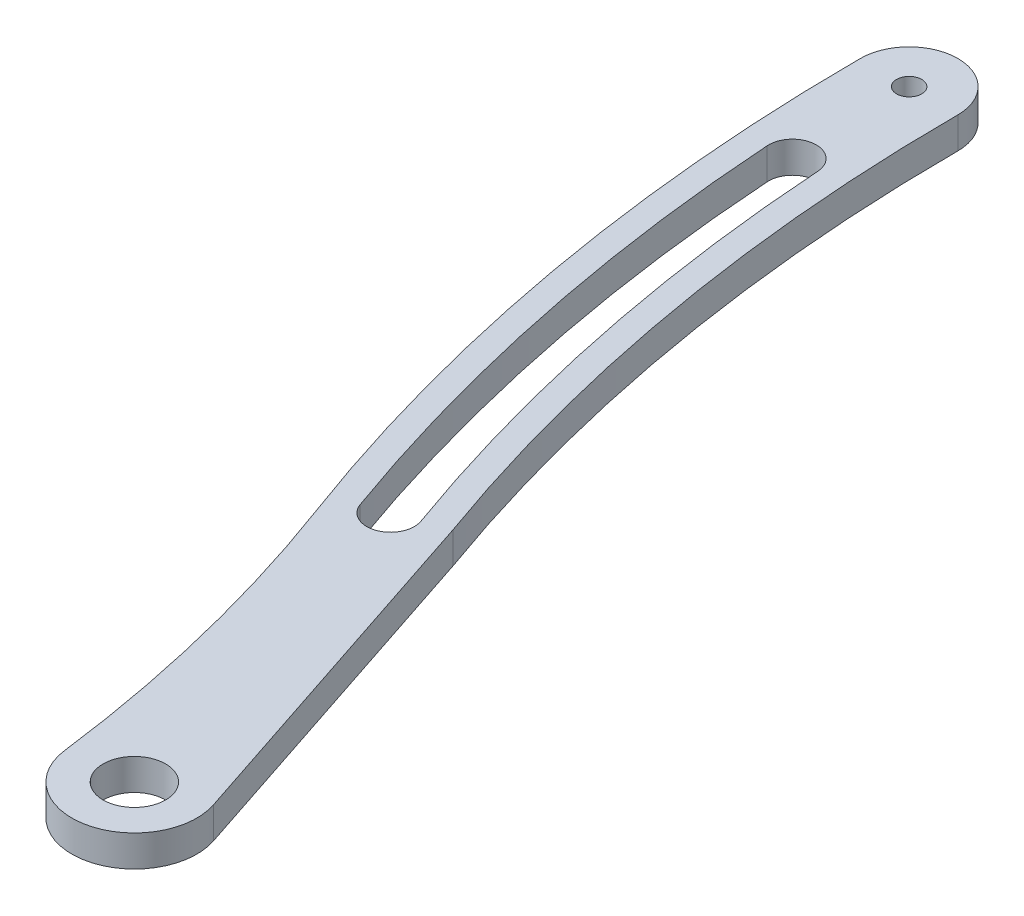
ISO-10303-21;
HEADER;
FILE_DESCRIPTION(('STEP AP214'),'2;1');
FILE_NAME('part.step','',(''),(''),'','','');
FILE_SCHEMA(('AUTOMOTIVE_DESIGN { 1 0 10303 214 1 1 1 1 }'));
ENDSEC;
DATA;
#1=APPLICATION_CONTEXT('core data for automotive mechanical design processes');
#2=APPLICATION_PROTOCOL_DEFINITION('international standard','automotive_design',2000,#1);
#3=PRODUCT_CONTEXT('',#1,'mechanical');
#4=PRODUCT('Part','Part','',(#3));
#5=PRODUCT_RELATED_PRODUCT_CATEGORY('part','',(#4));
#6=PRODUCT_DEFINITION_FORMATION('','',#4);
#7=PRODUCT_DEFINITION_CONTEXT('part definition',#1,'design');
#8=PRODUCT_DEFINITION('design','',#6,#7);
#9=PRODUCT_DEFINITION_SHAPE('','',#8);
#10=(LENGTH_UNIT() NAMED_UNIT(*) SI_UNIT(.MILLI.,.METRE.));
#11=(NAMED_UNIT(*) PLANE_ANGLE_UNIT() SI_UNIT($,.RADIAN.));
#12=(NAMED_UNIT(*) SI_UNIT($,.STERADIAN.) SOLID_ANGLE_UNIT());
#13=UNCERTAINTY_MEASURE_WITH_UNIT(LENGTH_MEASURE(1.E-05),#10,'distance_accuracy_value','');
#14=(GEOMETRIC_REPRESENTATION_CONTEXT(3) GLOBAL_UNCERTAINTY_ASSIGNED_CONTEXT((#13)) GLOBAL_UNIT_ASSIGNED_CONTEXT((#10,
#11,#12)) REPRESENTATION_CONTEXT('',''));
#15=CARTESIAN_POINT('',(0.,0.,0.));
#16=DIRECTION('',(0.,0.,1.));
#17=DIRECTION('',(1.,0.,0.));
#18=AXIS2_PLACEMENT_3D('',#15,#16,#17);
#19=CARTESIAN_POINT('',(-202.28141858722,6.35,-214.607120859536));
#20=DIRECTION('',(0.,-1.,0.));
#21=DIRECTION('',(0.,0.,-1.));
#22=AXIS2_PLACEMENT_3D('',#19,#20,#21);
#23=CYLINDRICAL_SURFACE('',#22,4.82599999999997);
#24=CARTESIAN_POINT('',(-202.28141858722,0.,-214.607120859536));
#25=DIRECTION('',(0.,1.,0.));
#26=DIRECTION('',(0.,0.,1.));
#27=AXIS2_PLACEMENT_3D('',#24,#25,#26);
#28=CIRCLE('',#27,4.82599999999997);
#29=CARTESIAN_POINT('',(-206.821322105213,0.,-212.970187126206));
#30=VERTEX_POINT('',#29);
#31=CARTESIAN_POINT('',(-197.741515069227,0.,-216.244054592867));
#32=VERTEX_POINT('',#31);
#33=EDGE_CURVE('E172',#30,#32,#28,.T.);
#34=ORIENTED_EDGE('',*,*,#33,.F.);
#35=DIRECTION('',(0.,-1.,0.));
#36=VECTOR('',#35,1.);
#37=CARTESIAN_POINT('',(-206.821322105213,6.35,-212.970187126206));
#38=LINE('',#37,#36);
#39=CARTESIAN_POINT('',(-206.821322105213,6.35,-212.970187126206));
#40=VERTEX_POINT('',#39);
#41=EDGE_CURVE('E11',#40,#30,#38,.T.);
#42=ORIENTED_EDGE('',*,*,#41,.F.);
#43=CARTESIAN_POINT('',(-202.28141858722,6.35,-214.607120859536));
#44=DIRECTION('',(0.,1.,0.));
#45=DIRECTION('',(0.,0.,1.));
#46=AXIS2_PLACEMENT_3D('',#43,#44,#45);
#47=CIRCLE('',#46,4.82599999999997);
#48=CARTESIAN_POINT('',(-197.741515069227,6.35,-216.244054592867));
#49=VERTEX_POINT('',#48);
#50=EDGE_CURVE('E140',#40,#49,#47,.T.);
#51=ORIENTED_EDGE('',*,*,#50,.T.);
#52=DIRECTION('',(0.,-1.,0.));
#53=VECTOR('',#52,1.);
#54=CARTESIAN_POINT('',(-197.741515069227,6.35,-216.244054592867));
#55=LINE('',#54,#53);
#56=EDGE_CURVE('E95',#49,#32,#55,.T.);
#57=ORIENTED_EDGE('',*,*,#56,.T.);
#58=EDGE_LOOP('',(#34,#42,#51,#57));
#59=FACE_BOUND('',#58,.T.);
#60=ADVANCED_FACE('F35',(#59),#23,.F.);
#61=CARTESIAN_POINT('',(151.592113525818,6.35,-342.201797652272));
#62=DIRECTION('',(0.,-1.,0.));
#63=DIRECTION('',(0.,0.,-1.));
#64=AXIS2_PLACEMENT_3D('',#61,#62,#63);
#65=CYLINDRICAL_SURFACE('',#64,381.);
#66=CARTESIAN_POINT('',(151.592113525818,0.,-342.201797652272));
#67=DIRECTION('',(0.,1.,0.));
#68=DIRECTION('',(0.,0.,1.));
#69=AXIS2_PLACEMENT_3D('',#66,#67,#68);
#70=CIRCLE('',#69,381.);
#71=CARTESIAN_POINT('',(-228.6,0.,-317.403474870848));
#72=VERTEX_POINT('',#71);
#73=EDGE_CURVE('E129',#72,#30,#70,.T.);
#74=ORIENTED_EDGE('',*,*,#73,.F.);
#75=DIRECTION('',(0.,-1.,0.));
#76=VECTOR('',#75,1.);
#77=CARTESIAN_POINT('',(-228.6,6.35,-317.403474870848));
#78=LINE('',#77,#76);
#79=CARTESIAN_POINT('',(-228.6,6.35,-317.403474870848));
#80=VERTEX_POINT('',#79);
#81=EDGE_CURVE('E45',#80,#72,#78,.T.);
#82=ORIENTED_EDGE('',*,*,#81,.F.);
#83=CARTESIAN_POINT('',(151.592113525818,6.35,-342.201797652272));
#84=DIRECTION('',(0.,1.,0.));
#85=DIRECTION('',(0.,0.,1.));
#86=AXIS2_PLACEMENT_3D('',#83,#84,#85);
#87=CIRCLE('',#86,381.);
#88=EDGE_CURVE('E127',#80,#40,#87,.T.);
#89=ORIENTED_EDGE('',*,*,#88,.T.);
#90=ORIENTED_EDGE('',*,*,#41,.T.);
#91=EDGE_LOOP('',(#74,#82,#89,#90));
#92=FACE_BOUND('',#91,.T.);
#93=ADVANCED_FACE('F125',(#92),#65,.F.);
#94=CARTESIAN_POINT('',(-223.784233228673,6.35,-317.717586959413));
#95=DIRECTION('',(0.,-1.,0.));
#96=DIRECTION('',(0.,0.,-1.));
#97=AXIS2_PLACEMENT_3D('',#94,#95,#96);
#98=CYLINDRICAL_SURFACE('',#97,4.82599999999998);
#99=CARTESIAN_POINT('',(-223.784233228673,0.,-317.717586959413));
#100=DIRECTION('',(0.,1.,0.));
#101=DIRECTION('',(0.,0.,1.));
#102=AXIS2_PLACEMENT_3D('',#99,#100,#101);
#103=CIRCLE('',#102,4.82599999999998);
#104=CARTESIAN_POINT('',(-218.968466457346,0.,-318.031699047977));
#105=VERTEX_POINT('',#104);
#106=EDGE_CURVE('E175',#72,#105,#103,.F.);
#107=ORIENTED_EDGE('',*,*,#106,.T.);
#108=DIRECTION('',(0.,-1.,0.));
#109=VECTOR('',#108,1.);
#110=CARTESIAN_POINT('',(-218.968466457346,6.35,-318.031699047977));
#111=LINE('',#110,#109);
#112=CARTESIAN_POINT('',(-218.968466457346,6.35,-318.031699047977));
#113=VERTEX_POINT('',#112);
#114=EDGE_CURVE('E132',#113,#105,#111,.T.);
#115=ORIENTED_EDGE('',*,*,#114,.F.);
#116=CARTESIAN_POINT('',(-223.784233228673,6.35,-317.717586959413));
#117=DIRECTION('',(0.,1.,0.));
#118=DIRECTION('',(0.,0.,1.));
#119=AXIS2_PLACEMENT_3D('',#116,#117,#118);
#120=CIRCLE('',#119,4.82599999999998);
#121=EDGE_CURVE('E135',#80,#113,#120,.F.);
#122=ORIENTED_EDGE('',*,*,#121,.F.);
#123=ORIENTED_EDGE('',*,*,#81,.T.);
#124=EDGE_LOOP('',(#107,#115,#122,#123));
#125=FACE_BOUND('',#124,.T.);
#126=ADVANCED_FACE('F136',(#125),#98,.F.);
#127=CARTESIAN_POINT('',(-224.581886474182,6.35,-342.201797652272));
#128=DIRECTION('',(0.,-1.,0.));
#129=DIRECTION('',(0.,0.,-1.));
#130=AXIS2_PLACEMENT_3D('',#127,#128,#129);
#131=CYLINDRICAL_SURFACE('',#130,9.90600000000007);
#132=CARTESIAN_POINT('',(-224.581886474182,0.,-342.201797652272));
#133=DIRECTION('',(0.,1.,0.));
#134=DIRECTION('',(0.,0.,1.));
#135=AXIS2_PLACEMENT_3D('',#132,#133,#134);
#136=CIRCLE('',#135,9.90600000000007);
#137=CARTESIAN_POINT('',(-234.487886474182,0.,-342.201797652272));
#138=VERTEX_POINT('',#137);
#139=CARTESIAN_POINT('',(-214.675886474182,0.,-342.201797652272));
#140=VERTEX_POINT('',#139);
#141=EDGE_CURVE('E151',#138,#140,#136,.F.);
#142=ORIENTED_EDGE('',*,*,#141,.F.);
#143=DIRECTION('',(0.,-1.,0.));
#144=VECTOR('',#143,1.);
#145=CARTESIAN_POINT('',(-234.487886474182,6.35,-342.201797652272));
#146=LINE('',#145,#144);
#147=CARTESIAN_POINT('',(-234.487886474182,6.35,-342.201797652272));
#148=VERTEX_POINT('',#147);
#149=EDGE_CURVE('E39',#148,#138,#146,.T.);
#150=ORIENTED_EDGE('',*,*,#149,.F.);
#151=CARTESIAN_POINT('',(-224.581886474182,6.35,-342.201797652272));
#152=DIRECTION('',(0.,1.,0.));
#153=DIRECTION('',(0.,0.,1.));
#154=AXIS2_PLACEMENT_3D('',#151,#152,#153);
#155=CIRCLE('',#154,9.90600000000007);
#156=CARTESIAN_POINT('',(-214.675886474182,6.35,-342.201797652272));
#157=VERTEX_POINT('',#156);
#158=EDGE_CURVE('E181',#148,#157,#155,.F.);
#159=ORIENTED_EDGE('',*,*,#158,.T.);
#160=DIRECTION('',(0.,-1.,0.));
#161=VECTOR('',#160,1.);
#162=CARTESIAN_POINT('',(-214.675886474182,6.35,-342.201797652272));
#163=LINE('',#162,#161);
#164=EDGE_CURVE('E150',#157,#140,#163,.T.);
#165=ORIENTED_EDGE('',*,*,#164,.T.);
#166=EDGE_LOOP('',(#142,#150,#159,#165));
#167=FACE_BOUND('',#166,.T.);
#168=ADVANCED_FACE('F37',(#167),#131,.T.);
#169=CARTESIAN_POINT('',(151.592113525818,6.35,-342.201797652272));
#170=DIRECTION('',(0.,-1.,0.));
#171=DIRECTION('',(0.,0.,-1.));
#172=AXIS2_PLACEMENT_3D('',#169,#170,#171);
#173=CYLINDRICAL_SURFACE('',#172,386.08);
#174=CARTESIAN_POINT('',(151.592113525818,0.,-342.201797652272));
#175=DIRECTION('',(0.,1.,0.));
#176=DIRECTION('',(0.,0.,1.));
#177=AXIS2_PLACEMENT_3D('',#174,#175,#176);
#178=CIRCLE('',#177,386.08);
#179=CARTESIAN_POINT('',(-210.27350163761,0.,-207.624522592944));
#180=VERTEX_POINT('',#179);
#181=EDGE_CURVE('E154',#138,#180,#178,.T.);
#182=ORIENTED_EDGE('',*,*,#181,.T.);
#183=DIRECTION('',(0.,-1.,0.));
#184=VECTOR('',#183,1.);
#185=CARTESIAN_POINT('',(-210.27350163761,6.35,-207.624522592944));
#186=LINE('',#185,#184);
#187=CARTESIAN_POINT('',(-210.27350163761,6.35,-207.624522592944));
#188=VERTEX_POINT('',#187);
#189=EDGE_CURVE('E190',#188,#180,#186,.T.);
#190=ORIENTED_EDGE('',*,*,#189,.F.);
#191=CARTESIAN_POINT('',(151.592113525818,6.35,-342.201797652272));
#192=DIRECTION('',(0.,1.,0.));
#193=DIRECTION('',(0.,0.,1.));
#194=AXIS2_PLACEMENT_3D('',#191,#192,#193);
#195=CIRCLE('',#194,386.08);
#196=EDGE_CURVE('E198',#148,#188,#195,.T.);
#197=ORIENTED_EDGE('',*,*,#196,.F.);
#198=ORIENTED_EDGE('',*,*,#149,.T.);
#199=EDGE_LOOP('',(#182,#190,#197,#198));
#200=FACE_BOUND('',#199,.T.);
#201=ADVANCED_FACE('F197',(#200),#173,.T.);
#202=CARTESIAN_POINT('',(-495.95688202979,6.35,-101.379305440843));
#203=DIRECTION('',(0.,-1.,0.));
#204=DIRECTION('',(0.,0.,-1.));
#205=AXIS2_PLACEMENT_3D('',#202,#203,#204);
#206=CYLINDRICAL_SURFACE('',#205,304.8);
#207=CARTESIAN_POINT('',(-495.95688202979,0.,-101.379305440843));
#208=DIRECTION('',(0.,1.,0.));
#209=DIRECTION('',(0.,0.,1.));
#210=AXIS2_PLACEMENT_3D('',#207,#208,#209);
#211=CIRCLE('',#210,304.8);
#212=CARTESIAN_POINT('',(-193.574275281192,0.,-139.691172217634));
#213=VERTEX_POINT('',#212);
#214=EDGE_CURVE('E157',#213,#180,#211,.T.);
#215=ORIENTED_EDGE('',*,*,#214,.F.);
#216=DIRECTION('',(0.,-1.,0.));
#217=VECTOR('',#216,1.);
#218=CARTESIAN_POINT('',(-193.574275281192,6.35,-139.691172217634));
#219=LINE('',#218,#217);
#220=CARTESIAN_POINT('',(-193.574275281192,6.35,-139.691172217634));
#221=VERTEX_POINT('',#220);
#222=EDGE_CURVE('E189',#221,#213,#219,.T.);
#223=ORIENTED_EDGE('',*,*,#222,.F.);
#224=CARTESIAN_POINT('',(-495.95688202979,6.35,-101.379305440843));
#225=DIRECTION('',(0.,1.,0.));
#226=DIRECTION('',(0.,0.,1.));
#227=AXIS2_PLACEMENT_3D('',#224,#225,#226);
#228=CIRCLE('',#227,304.8);
#229=EDGE_CURVE('E223',#221,#188,#228,.T.);
#230=ORIENTED_EDGE('',*,*,#229,.T.);
#231=ORIENTED_EDGE('',*,*,#189,.T.);
#232=EDGE_LOOP('',(#215,#223,#230,#231));
#233=FACE_BOUND('',#232,.T.);
#234=ADVANCED_FACE('F222',(#233),#206,.F.);
#235=CARTESIAN_POINT('',(-180.975,6.35,-141.2875));
#236=DIRECTION('',(0.,-1.,0.));
#237=DIRECTION('',(0.,0.,-1.));
#238=AXIS2_PLACEMENT_3D('',#235,#236,#237);
#239=CYLINDRICAL_SURFACE('',#238,12.7);
#240=CARTESIAN_POINT('',(-180.975,0.,-141.2875));
#241=DIRECTION('',(0.,1.,0.));
#242=DIRECTION('',(0.,0.,1.));
#243=AXIS2_PLACEMENT_3D('',#240,#241,#242);
#244=CIRCLE('',#243,12.7);
#245=CARTESIAN_POINT('',(-168.917534434013,0.,-145.275923764476));
#246=VERTEX_POINT('',#245);
#247=EDGE_CURVE('E160',#213,#246,#244,.T.);
#248=ORIENTED_EDGE('',*,*,#247,.T.);
#249=DIRECTION('',(0.,-1.,0.));
#250=VECTOR('',#249,1.);
#251=CARTESIAN_POINT('',(-168.917534434013,6.35,-145.275923764476));
#252=LINE('',#251,#250);
#253=CARTESIAN_POINT('',(-168.917534434013,6.35,-145.275923764476));
#254=VERTEX_POINT('',#253);
#255=EDGE_CURVE('E187',#254,#246,#252,.T.);
#256=ORIENTED_EDGE('',*,*,#255,.F.);
#257=CARTESIAN_POINT('',(-180.975,6.35,-141.2875));
#258=DIRECTION('',(0.,1.,0.));
#259=DIRECTION('',(0.,0.,1.));
#260=AXIS2_PLACEMENT_3D('',#257,#258,#259);
#261=CIRCLE('',#260,12.7);
#262=EDGE_CURVE('E220',#221,#254,#261,.T.);
#263=ORIENTED_EDGE('',*,*,#262,.F.);
#264=ORIENTED_EDGE('',*,*,#222,.T.);
#265=EDGE_LOOP('',(#248,#256,#263,#264));
#266=FACE_BOUND('',#265,.T.);
#267=ADVANCED_FACE('F219',(#266),#239,.T.);
#268=CARTESIAN_POINT('',(-108.942210946829,6.35,36.0364042274872));
#269=DIRECTION('',(0.949406737479288,0.,-0.314049115313089));
#270=DIRECTION('',(-0.314049115313089,0.,-0.949406737479288));
#271=AXIS2_PLACEMENT_3D('',#268,#269,#270);
#272=PLANE('',#271);
#273=DIRECTION('',(0.314049115313089,0.,0.949406737479288));
#274=VECTOR('',#273,1.);
#275=CARTESIAN_POINT('',(-108.942210946829,0.,36.0364042274872));
#276=LINE('',#275,#274);
#277=CARTESIAN_POINT('',(-192.962669260813,0.,-217.967142733214));
#278=VERTEX_POINT('',#277);
#279=EDGE_CURVE('E163',#278,#246,#276,.T.);
#280=ORIENTED_EDGE('',*,*,#279,.F.);
#281=DIRECTION('',(0.,-1.,0.));
#282=VECTOR('',#281,1.);
#283=CARTESIAN_POINT('',(-192.962669260813,6.35,-217.967142733214));
#284=LINE('',#283,#282);
#285=CARTESIAN_POINT('',(-192.962669260813,6.35,-217.967142733214));
#286=VERTEX_POINT('',#285);
#287=EDGE_CURVE('E185',#286,#278,#284,.T.);
#288=ORIENTED_EDGE('',*,*,#287,.F.);
#289=DIRECTION('',(0.314049115313089,0.,0.949406737479288));
#290=VECTOR('',#289,1.);
#291=CARTESIAN_POINT('',(-108.942210946829,6.35,36.0364042274872));
#292=LINE('',#291,#290);
#293=EDGE_CURVE('E216',#286,#254,#292,.T.);
#294=ORIENTED_EDGE('',*,*,#293,.T.);
#295=ORIENTED_EDGE('',*,*,#255,.T.);
#296=EDGE_LOOP('',(#280,#288,#294,#295));
#297=FACE_BOUND('',#296,.T.);
#298=ADVANCED_FACE('F212',(#297),#272,.T.);
#299=CARTESIAN_POINT('',(151.592113525818,6.35,-342.201797652272));
#300=DIRECTION('',(0.,-1.,0.));
#301=DIRECTION('',(0.,0.,-1.));
#302=AXIS2_PLACEMENT_3D('',#299,#300,#301);
#303=CYLINDRICAL_SURFACE('',#302,371.348);
#304=CARTESIAN_POINT('',(151.592113525818,0.,-342.201797652272));
#305=DIRECTION('',(0.,1.,0.));
#306=DIRECTION('',(0.,0.,1.));
#307=AXIS2_PLACEMENT_3D('',#304,#305,#306);
#308=CIRCLE('',#307,371.348);
#309=EDGE_CURVE('E88',#105,#32,#308,.T.);
#310=ORIENTED_EDGE('',*,*,#309,.T.);
#311=ORIENTED_EDGE('',*,*,#56,.F.);
#312=CARTESIAN_POINT('',(151.592113525818,6.35,-342.201797652272));
#313=DIRECTION('',(0.,1.,0.));
#314=DIRECTION('',(0.,0.,1.));
#315=AXIS2_PLACEMENT_3D('',#312,#313,#314);
#316=CIRCLE('',#315,371.348);
#317=EDGE_CURVE('E54',#113,#49,#316,.T.);
#318=ORIENTED_EDGE('',*,*,#317,.F.);
#319=ORIENTED_EDGE('',*,*,#114,.T.);
#320=EDGE_LOOP('',(#310,#311,#318,#319));
#321=FACE_BOUND('',#320,.T.);
#322=ADVANCED_FACE('F257',(#321),#303,.T.);
#323=CARTESIAN_POINT('',(-224.581886474182,6.35,-342.201797652272));
#324=DIRECTION('',(0.,-1.,0.));
#325=DIRECTION('',(0.,0.,-1.));
#326=AXIS2_PLACEMENT_3D('',#323,#324,#325);
#327=CYLINDRICAL_SURFACE('',#326,2.55269999999998);
#328=CARTESIAN_POINT('',(-224.581886474182,6.35,-342.201797652272));
#329=DIRECTION('',(0.,1.,0.));
#330=DIRECTION('',(0.,0.,1.));
#331=AXIS2_PLACEMENT_3D('',#328,#329,#330);
#332=CIRCLE('',#331,2.55269999999998);
#333=CARTESIAN_POINT('',(-224.581886474182,6.35,-339.649097652272));
#334=VERTEX_POINT('',#333);
#335=EDGE_CURVE('E142',#334,#334,#332,.T.);
#336=ORIENTED_EDGE('',*,*,#335,.T.);
#337=EDGE_LOOP('',(#336));
#338=FACE_BOUND('',#337,.T.);
#339=CARTESIAN_POINT('',(-224.581886474182,0.,-342.201797652272));
#340=DIRECTION('',(0.,1.,0.));
#341=DIRECTION('',(0.,0.,1.));
#342=AXIS2_PLACEMENT_3D('',#339,#340,#341);
#343=CIRCLE('',#342,2.55269999999998);
#344=CARTESIAN_POINT('',(-224.581886474182,0.,-339.649097652272));
#345=VERTEX_POINT('',#344);
#346=EDGE_CURVE('E169',#345,#345,#343,.T.);
#347=ORIENTED_EDGE('',*,*,#346,.F.);
#348=EDGE_LOOP('',(#347));
#349=FACE_BOUND('',#348,.T.);
#350=ADVANCED_FACE('F234',(#338,#349),#327,.F.);
#351=CARTESIAN_POINT('',(151.592113525818,6.35,-342.201797652272));
#352=DIRECTION('',(0.,-1.,0.));
#353=DIRECTION('',(0.,0.,-1.));
#354=AXIS2_PLACEMENT_3D('',#351,#352,#353);
#355=CYLINDRICAL_SURFACE('',#354,366.268);
#356=CARTESIAN_POINT('',(151.592113525818,0.,-342.201797652272));
#357=DIRECTION('',(0.,1.,0.));
#358=DIRECTION('',(0.,0.,1.));
#359=AXIS2_PLACEMENT_3D('',#356,#357,#358);
#360=CIRCLE('',#359,366.268);
#361=EDGE_CURVE('E166',#140,#278,#360,.T.);
#362=ORIENTED_EDGE('',*,*,#361,.F.);
#363=ORIENTED_EDGE('',*,*,#164,.F.);
#364=CARTESIAN_POINT('',(151.592113525818,6.35,-342.201797652272));
#365=DIRECTION('',(0.,1.,0.));
#366=DIRECTION('',(0.,0.,1.));
#367=AXIS2_PLACEMENT_3D('',#364,#365,#366);
#368=CIRCLE('',#367,366.268);
#369=EDGE_CURVE('E209',#157,#286,#368,.T.);
#370=ORIENTED_EDGE('',*,*,#369,.T.);
#371=ORIENTED_EDGE('',*,*,#287,.T.);
#372=EDGE_LOOP('',(#362,#363,#370,#371));
#373=FACE_BOUND('',#372,.T.);
#374=ADVANCED_FACE('F208',(#373),#355,.F.);
#375=CARTESIAN_POINT('',(-180.975,6.35,-141.2875));
#376=DIRECTION('',(0.,-1.,0.));
#377=DIRECTION('',(0.,0.,-1.));
#378=AXIS2_PLACEMENT_3D('',#375,#376,#377);
#379=CYLINDRICAL_SURFACE('',#378,6.34999999999999);
#380=CARTESIAN_POINT('',(-180.975,6.35,-141.2875));
#381=DIRECTION('',(0.,1.,0.));
#382=DIRECTION('',(0.,0.,1.));
#383=AXIS2_PLACEMENT_3D('',#380,#381,#382);
#384=CIRCLE('',#383,6.34999999999999);
#385=CARTESIAN_POINT('',(-180.975,6.35,-134.9375));
#386=VERTEX_POINT('',#385);
#387=EDGE_CURVE('E147',#386,#386,#384,.T.);
#388=ORIENTED_EDGE('',*,*,#387,.T.);
#389=EDGE_LOOP('',(#388));
#390=FACE_BOUND('',#389,.T.);
#391=CARTESIAN_POINT('',(-180.975,0.,-141.2875));
#392=DIRECTION('',(0.,1.,0.));
#393=DIRECTION('',(0.,0.,1.));
#394=AXIS2_PLACEMENT_3D('',#391,#392,#393);
#395=CIRCLE('',#394,6.34999999999999);
#396=CARTESIAN_POINT('',(-180.975,0.,-134.9375));
#397=VERTEX_POINT('',#396);
#398=EDGE_CURVE('E178',#397,#397,#395,.T.);
#399=ORIENTED_EDGE('',*,*,#398,.F.);
#400=EDGE_LOOP('',(#399));
#401=FACE_BOUND('',#400,.T.);
#402=ADVANCED_FACE('F238',(#390,#401),#379,.F.);
#403=CARTESIAN_POINT('',(0.,6.35,0.));
#404=DIRECTION('',(0.,1.,0.));
#405=DIRECTION('',(0.,0.,1.));
#406=AXIS2_PLACEMENT_3D('',#403,#404,#405);
#407=PLANE('',#406);
#408=ORIENTED_EDGE('',*,*,#158,.F.);
#409=ORIENTED_EDGE('',*,*,#196,.T.);
#410=ORIENTED_EDGE('',*,*,#229,.F.);
#411=ORIENTED_EDGE('',*,*,#262,.T.);
#412=ORIENTED_EDGE('',*,*,#293,.F.);
#413=ORIENTED_EDGE('',*,*,#369,.F.);
#414=EDGE_LOOP('',(#408,#409,#410,#411,#412,#413));
#415=FACE_BOUND('',#414,.T.);
#416=ORIENTED_EDGE('',*,*,#335,.F.);
#417=EDGE_LOOP('',(#416));
#418=FACE_BOUND('',#417,.T.);
#419=ORIENTED_EDGE('',*,*,#50,.F.);
#420=ORIENTED_EDGE('',*,*,#88,.F.);
#421=ORIENTED_EDGE('',*,*,#121,.T.);
#422=ORIENTED_EDGE('',*,*,#317,.T.);
#423=EDGE_LOOP('',(#419,#420,#421,#422));
#424=FACE_BOUND('',#423,.T.);
#425=ORIENTED_EDGE('',*,*,#387,.F.);
#426=EDGE_LOOP('',(#425));
#427=FACE_BOUND('',#426,.T.);
#428=ADVANCED_FACE('F138',(#415,#418,#424,#427),#407,.T.);
#429=CARTESIAN_POINT('',(0.,0.,0.));
#430=DIRECTION('',(0.,1.,0.));
#431=DIRECTION('',(0.,0.,1.));
#432=AXIS2_PLACEMENT_3D('',#429,#430,#431);
#433=PLANE('',#432);
#434=ORIENTED_EDGE('',*,*,#141,.T.);
#435=ORIENTED_EDGE('',*,*,#361,.T.);
#436=ORIENTED_EDGE('',*,*,#279,.T.);
#437=ORIENTED_EDGE('',*,*,#247,.F.);
#438=ORIENTED_EDGE('',*,*,#214,.T.);
#439=ORIENTED_EDGE('',*,*,#181,.F.);
#440=EDGE_LOOP('',(#434,#435,#436,#437,#438,#439));
#441=FACE_BOUND('',#440,.T.);
#442=ORIENTED_EDGE('',*,*,#346,.T.);
#443=EDGE_LOOP('',(#442));
#444=FACE_BOUND('',#443,.T.);
#445=ORIENTED_EDGE('',*,*,#33,.T.);
#446=ORIENTED_EDGE('',*,*,#309,.F.);
#447=ORIENTED_EDGE('',*,*,#106,.F.);
#448=ORIENTED_EDGE('',*,*,#73,.T.);
#449=EDGE_LOOP('',(#445,#446,#447,#448));
#450=FACE_BOUND('',#449,.T.);
#451=ORIENTED_EDGE('',*,*,#398,.T.);
#452=EDGE_LOOP('',(#451));
#453=FACE_BOUND('',#452,.T.);
#454=ADVANCED_FACE('F201',(#441,#444,#450,#453),#433,.F.);
#455=CLOSED_SHELL('',(#60,#93,#126,#168,#201,#234,#267,#298,#322,#350,#374,#402,#428,#454));
#456=MANIFOLD_SOLID_BREP('B2',#455);
#457=ADVANCED_BREP_SHAPE_REPRESENTATION('',(#18,#456),#14);
#458=SHAPE_DEFINITION_REPRESENTATION(#9,#457);
ENDSEC;
END-ISO-10303-21;
